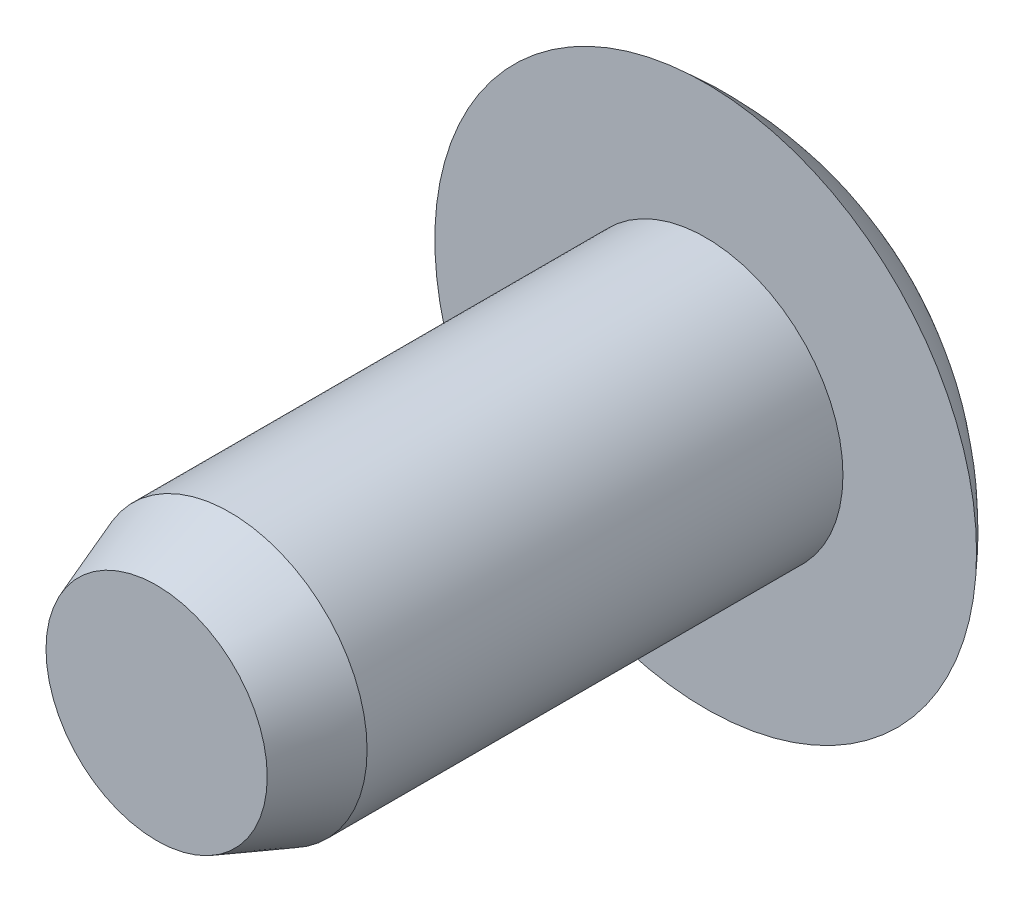
ISO-10303-21;
HEADER;
FILE_DESCRIPTION(('STEP AP214'),'2;1');
FILE_NAME('part.step','',(''),(''),'','','');
FILE_SCHEMA(('AUTOMOTIVE_DESIGN { 1 0 10303 214 1 1 1 1 }'));
ENDSEC;
DATA;
#1=APPLICATION_CONTEXT('core data for automotive mechanical design processes');
#2=APPLICATION_PROTOCOL_DEFINITION('international standard','automotive_design',2000,#1);
#3=PRODUCT_CONTEXT('',#1,'mechanical');
#4=PRODUCT('Part','Part','',(#3));
#5=PRODUCT_RELATED_PRODUCT_CATEGORY('part','',(#4));
#6=PRODUCT_DEFINITION_FORMATION('','',#4);
#7=PRODUCT_DEFINITION_CONTEXT('part definition',#1,'design');
#8=PRODUCT_DEFINITION('design','',#6,#7);
#9=PRODUCT_DEFINITION_SHAPE('','',#8);
#10=(LENGTH_UNIT() NAMED_UNIT(*) SI_UNIT(.MILLI.,.METRE.));
#11=(NAMED_UNIT(*) PLANE_ANGLE_UNIT() SI_UNIT($,.RADIAN.));
#12=(NAMED_UNIT(*) SI_UNIT($,.STERADIAN.) SOLID_ANGLE_UNIT());
#13=UNCERTAINTY_MEASURE_WITH_UNIT(LENGTH_MEASURE(1.E-05),#10,'distance_accuracy_value','');
#14=(GEOMETRIC_REPRESENTATION_CONTEXT(3) GLOBAL_UNCERTAINTY_ASSIGNED_CONTEXT((#13)) GLOBAL_UNIT_ASSIGNED_CONTEXT((#10,
#11,#12)) REPRESENTATION_CONTEXT('',''));
#15=CARTESIAN_POINT('',(0.,0.,0.));
#16=DIRECTION('',(0.,0.,1.));
#17=DIRECTION('',(1.,0.,0.));
#18=AXIS2_PLACEMENT_3D('',#15,#16,#17);
#19=CARTESIAN_POINT('',(0.,0.,-2.74544117647059));
#20=DIRECTION('',(0.,0.,1.));
#21=DIRECTION('',(1.,0.,0.));
#22=AXIS2_PLACEMENT_3D('',#19,#20,#21);
#23=SPHERICAL_SURFACE('',#22,3.09655882352941);
#24=CARTESIAN_POINT('',(0.,0.,-4.7625));
#25=DIRECTION('',(0.,0.,1.));
#26=DIRECTION('',(1.,0.,0.));
#27=AXIS2_PLACEMENT_3D('',#24,#25,#26);
#28=CIRCLE('',#27,2.3495);
#29=CARTESIAN_POINT('',(2.3495,0.,-4.7625));
#30=VERTEX_POINT('',#29);
#31=EDGE_CURVE('E41',#30,#30,#28,.T.);
#32=ORIENTED_EDGE('',*,*,#31,.F.);
#33=EDGE_LOOP('',(#32));
#34=FACE_BOUND('',#33,.T.);
#35=ADVANCED_FACE('F30',(#34),#23,.T.);
#36=CARTESIAN_POINT('',(1.190625,0.,-4.7625));
#37=DIRECTION('',(0.,0.,1.));
#38=DIRECTION('',(1.,0.,0.));
#39=AXIS2_PLACEMENT_3D('',#36,#37,#38);
#40=PLANE('',#39);
#41=ORIENTED_EDGE('',*,*,#31,.T.);
#42=EDGE_LOOP('',(#41));
#43=FACE_BOUND('',#42,.T.);
#44=CARTESIAN_POINT('',(0.,0.,-4.7625));
#45=DIRECTION('',(0.,0.,1.));
#46=DIRECTION('',(1.,0.,0.));
#47=AXIS2_PLACEMENT_3D('',#44,#45,#46);
#48=CIRCLE('',#47,1.190625);
#49=CARTESIAN_POINT('',(1.190625,0.,-4.7625));
#50=VERTEX_POINT('',#49);
#51=EDGE_CURVE('E45',#50,#50,#48,.T.);
#52=ORIENTED_EDGE('',*,*,#51,.F.);
#53=EDGE_LOOP('',(#52));
#54=FACE_BOUND('',#53,.T.);
#55=ADVANCED_FACE('F53',(#43,#54),#40,.T.);
#56=CARTESIAN_POINT('',(0.,0.,0.));
#57=DIRECTION('',(0.,0.,1.));
#58=DIRECTION('',(1.,0.,0.));
#59=AXIS2_PLACEMENT_3D('',#56,#57,#58);
#60=CYLINDRICAL_SURFACE('',#59,1.190625);
#61=CARTESIAN_POINT('',(0.,0.,-0.635000000000005));
#62=DIRECTION('',(0.,0.,1.));
#63=DIRECTION('',(1.,0.,0.));
#64=AXIS2_PLACEMENT_3D('',#61,#62,#63);
#65=CIRCLE('',#64,1.190625);
#66=CARTESIAN_POINT('',(1.190625,0.,-0.635000000000005));
#67=VERTEX_POINT('',#66);
#68=EDGE_CURVE('E10',#67,#67,#65,.F.);
#69=ORIENTED_EDGE('',*,*,#68,.T.);
#70=EDGE_LOOP('',(#69));
#71=FACE_BOUND('',#70,.T.);
#72=ORIENTED_EDGE('',*,*,#51,.T.);
#73=EDGE_LOOP('',(#72));
#74=FACE_BOUND('',#73,.T.);
#75=ADVANCED_FACE('F51',(#71,#74),#60,.T.);
#76=CARTESIAN_POINT('',(0.,0.,0.));
#77=DIRECTION('',(0.,0.,1.));
#78=DIRECTION('',(1.,0.,0.));
#79=AXIS2_PLACEMENT_3D('',#76,#77,#78);
#80=PLANE('',#79);
#81=CARTESIAN_POINT('',(0.,0.,0.));
#82=DIRECTION('',(0.,0.,1.));
#83=DIRECTION('',(1.,0.,0.));
#84=AXIS2_PLACEMENT_3D('',#81,#82,#83);
#85=CIRCLE('',#84,0.959503901240962);
#86=CARTESIAN_POINT('',(0.959503901240962,0.,0.));
#87=VERTEX_POINT('',#86);
#88=EDGE_CURVE('E37',#87,#87,#85,.T.);
#89=ORIENTED_EDGE('',*,*,#88,.T.);
#90=EDGE_LOOP('',(#89));
#91=FACE_BOUND('',#90,.T.);
#92=ADVANCED_FACE('F61',(#91),#80,.T.);
#93=CARTESIAN_POINT('',(0.,0.,0.));
#94=DIRECTION('',(0.,0.,-1.));
#95=DIRECTION('',(-1.,0.,0.));
#96=AXIS2_PLACEMENT_3D('',#93,#94,#95);
#97=CONICAL_SURFACE('',#96,0.959503901240962,0.349065850398863);
#98=ORIENTED_EDGE('',*,*,#68,.F.);
#99=EDGE_LOOP('',(#98));
#100=FACE_BOUND('',#99,.T.);
#101=ORIENTED_EDGE('',*,*,#88,.F.);
#102=EDGE_LOOP('',(#101));
#103=FACE_BOUND('',#102,.T.);
#104=ADVANCED_FACE('F32',(#100,#103),#97,.T.);
#105=CLOSED_SHELL('',(#35,#55,#75,#92,#104));
#106=MANIFOLD_SOLID_BREP('B2',#105);
#107=ADVANCED_BREP_SHAPE_REPRESENTATION('',(#18,#106),#14);
#108=SHAPE_DEFINITION_REPRESENTATION(#9,#107);
ENDSEC;
END-ISO-10303-21;
